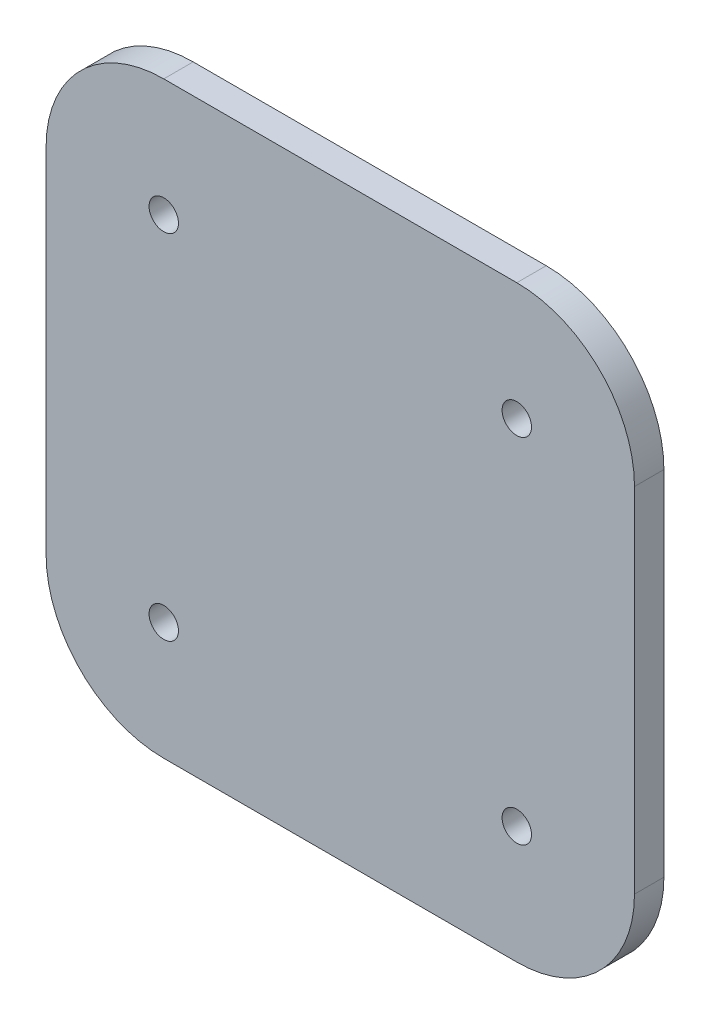
ISO-10303-21;
HEADER;
FILE_DESCRIPTION(('STEP AP214'),'2;1');
FILE_NAME('part.step','',(''),(''),'','','');
FILE_SCHEMA(('AUTOMOTIVE_DESIGN { 1 0 10303 214 1 1 1 1 }'));
ENDSEC;
DATA;
#1=APPLICATION_CONTEXT('core data for automotive mechanical design processes');
#2=APPLICATION_PROTOCOL_DEFINITION('international standard','automotive_design',2000,#1);
#3=PRODUCT_CONTEXT('',#1,'mechanical');
#4=PRODUCT('Part','Part','',(#3));
#5=PRODUCT_RELATED_PRODUCT_CATEGORY('part','',(#4));
#6=PRODUCT_DEFINITION_FORMATION('','',#4);
#7=PRODUCT_DEFINITION_CONTEXT('part definition',#1,'design');
#8=PRODUCT_DEFINITION('design','',#6,#7);
#9=PRODUCT_DEFINITION_SHAPE('','',#8);
#10=(LENGTH_UNIT() NAMED_UNIT(*) SI_UNIT(.MILLI.,.METRE.));
#11=(NAMED_UNIT(*) PLANE_ANGLE_UNIT() SI_UNIT($,.RADIAN.));
#12=(NAMED_UNIT(*) SI_UNIT($,.STERADIAN.) SOLID_ANGLE_UNIT());
#13=UNCERTAINTY_MEASURE_WITH_UNIT(LENGTH_MEASURE(1.E-05),#10,'distance_accuracy_value','');
#14=(GEOMETRIC_REPRESENTATION_CONTEXT(3) GLOBAL_UNCERTAINTY_ASSIGNED_CONTEXT((#13)) GLOBAL_UNIT_ASSIGNED_CONTEXT((#10,
#11,#12)) REPRESENTATION_CONTEXT('',''));
#15=CARTESIAN_POINT('',(0.,0.,0.));
#16=DIRECTION('',(0.,0.,1.));
#17=DIRECTION('',(1.,0.,0.));
#18=AXIS2_PLACEMENT_3D('',#15,#16,#17);
#19=CARTESIAN_POINT('',(-70.3611159052454,39.6364636209814,5.));
#20=DIRECTION('',(1.,0.,0.));
#21=DIRECTION('',(0.,1.,0.));
#22=AXIS2_PLACEMENT_3D('',#19,#20,#21);
#23=PLANE('',#22);
#24=DIRECTION('',(0.,-1.,0.));
#25=VECTOR('',#24,1.);
#26=CARTESIAN_POINT('',(-70.3611159052454,39.6364636209814,0.));
#27=LINE('',#26,#25);
#28=CARTESIAN_POINT('',(-70.3611159052454,19.6364636209814,0.));
#29=VERTEX_POINT('',#28);
#30=CARTESIAN_POINT('',(-70.3611159052453,-40.3635363790186,0.));
#31=VERTEX_POINT('',#30);
#32=EDGE_CURVE('E157',#29,#31,#27,.T.);
#33=ORIENTED_EDGE('',*,*,#32,.T.);
#34=DIRECTION('',(0.,0.,-1.));
#35=VECTOR('',#34,1.);
#36=CARTESIAN_POINT('',(-70.3611159052453,-40.3635363790186,5.));
#37=LINE('',#36,#35);
#38=CARTESIAN_POINT('',(-70.3611159052453,-40.3635363790186,5.));
#39=VERTEX_POINT('',#38);
#40=EDGE_CURVE('E11',#31,#39,#37,.F.);
#41=ORIENTED_EDGE('',*,*,#40,.T.);
#42=DIRECTION('',(0.,-1.,0.));
#43=VECTOR('',#42,1.);
#44=CARTESIAN_POINT('',(-70.3611159052454,39.6364636209814,5.));
#45=LINE('',#44,#43);
#46=CARTESIAN_POINT('',(-70.3611159052454,19.6364636209814,5.));
#47=VERTEX_POINT('',#46);
#48=EDGE_CURVE('E125',#47,#39,#45,.T.);
#49=ORIENTED_EDGE('',*,*,#48,.F.);
#50=DIRECTION('',(0.,0.,-1.));
#51=VECTOR('',#50,1.);
#52=CARTESIAN_POINT('',(-70.3611159052454,19.6364636209814,5.));
#53=LINE('',#52,#51);
#54=EDGE_CURVE('E41',#47,#29,#53,.T.);
#55=ORIENTED_EDGE('',*,*,#54,.T.);
#56=EDGE_LOOP('',(#33,#41,#49,#55));
#57=FACE_BOUND('',#56,.T.);
#58=ADVANCED_FACE('F33',(#57),#23,.F.);
#59=CARTESIAN_POINT('',(-70.3611159052453,-60.3635363790186,5.));
#60=DIRECTION('',(0.,1.,0.));
#61=DIRECTION('',(0.,0.,1.));
#62=AXIS2_PLACEMENT_3D('',#59,#60,#61);
#63=PLANE('',#62);
#64=DIRECTION('',(1.,0.,0.));
#65=VECTOR('',#64,1.);
#66=CARTESIAN_POINT('',(-70.3611159052453,-60.3635363790186,0.));
#67=LINE('',#66,#65);
#68=CARTESIAN_POINT('',(-50.3611159052453,-60.3635363790186,0.));
#69=VERTEX_POINT('',#68);
#70=CARTESIAN_POINT('',(9.63888409475464,-60.3635363790186,0.));
#71=VERTEX_POINT('',#70);
#72=EDGE_CURVE('E130',#69,#71,#67,.T.);
#73=ORIENTED_EDGE('',*,*,#72,.T.);
#74=DIRECTION('',(0.,0.,-1.));
#75=VECTOR('',#74,1.);
#76=CARTESIAN_POINT('',(9.63888409475466,-60.3635363790186,5.));
#77=LINE('',#76,#75);
#78=CARTESIAN_POINT('',(9.63888409475464,-60.3635363790186,5.));
#79=VERTEX_POINT('',#78);
#80=EDGE_CURVE('E48',#71,#79,#77,.F.);
#81=ORIENTED_EDGE('',*,*,#80,.T.);
#82=DIRECTION('',(1.,0.,0.));
#83=VECTOR('',#82,1.);
#84=CARTESIAN_POINT('',(-70.3611159052453,-60.3635363790186,5.));
#85=LINE('',#84,#83);
#86=CARTESIAN_POINT('',(-50.3611159052453,-60.3635363790186,5.));
#87=VERTEX_POINT('',#86);
#88=EDGE_CURVE('E128',#87,#79,#85,.T.);
#89=ORIENTED_EDGE('',*,*,#88,.F.);
#90=DIRECTION('',(0.,0.,-1.));
#91=VECTOR('',#90,1.);
#92=CARTESIAN_POINT('',(-50.3611159052453,-60.3635363790186,5.));
#93=LINE('',#92,#91);
#94=EDGE_CURVE('E149',#87,#69,#93,.T.);
#95=ORIENTED_EDGE('',*,*,#94,.T.);
#96=EDGE_LOOP('',(#73,#81,#89,#95));
#97=FACE_BOUND('',#96,.T.);
#98=ADVANCED_FACE('F219',(#97),#63,.F.);
#99=CARTESIAN_POINT('',(29.6388840947547,39.6364636209814,5.));
#100=DIRECTION('',(-1.,0.,0.));
#101=DIRECTION('',(0.,-1.,0.));
#102=AXIS2_PLACEMENT_3D('',#99,#100,#101);
#103=PLANE('',#102);
#104=DIRECTION('',(0.,1.,0.));
#105=VECTOR('',#104,1.);
#106=CARTESIAN_POINT('',(29.6388840947547,39.6364636209814,0.));
#107=LINE('',#106,#105);
#108=CARTESIAN_POINT('',(29.6388840947547,-40.3635363790186,0.));
#109=VERTEX_POINT('',#108);
#110=CARTESIAN_POINT('',(29.6388840947547,19.6364636209814,0.));
#111=VERTEX_POINT('',#110);
#112=EDGE_CURVE('E126',#109,#111,#107,.T.);
#113=ORIENTED_EDGE('',*,*,#112,.T.);
#114=DIRECTION('',(0.,0.,-1.));
#115=VECTOR('',#114,1.);
#116=CARTESIAN_POINT('',(29.6388840947547,19.6364636209814,5.));
#117=LINE('',#116,#115);
#118=CARTESIAN_POINT('',(29.6388840947547,19.6364636209814,5.));
#119=VERTEX_POINT('',#118);
#120=EDGE_CURVE('E104',#111,#119,#117,.F.);
#121=ORIENTED_EDGE('',*,*,#120,.T.);
#122=DIRECTION('',(0.,1.,0.));
#123=VECTOR('',#122,1.);
#124=CARTESIAN_POINT('',(29.6388840947547,39.6364636209814,5.));
#125=LINE('',#124,#123);
#126=CARTESIAN_POINT('',(29.6388840947547,-40.3635363790186,5.));
#127=VERTEX_POINT('',#126);
#128=EDGE_CURVE('E169',#127,#119,#125,.T.);
#129=ORIENTED_EDGE('',*,*,#128,.F.);
#130=DIRECTION('',(0.,0.,-1.));
#131=VECTOR('',#130,1.);
#132=CARTESIAN_POINT('',(29.6388840947547,-40.3635363790186,5.));
#133=LINE('',#132,#131);
#134=EDGE_CURVE('E109',#127,#109,#133,.T.);
#135=ORIENTED_EDGE('',*,*,#134,.T.);
#136=EDGE_LOOP('',(#113,#121,#129,#135));
#137=FACE_BOUND('',#136,.T.);
#138=ADVANCED_FACE('F216',(#137),#103,.F.);
#139=CARTESIAN_POINT('',(-70.3611159052454,39.6364636209814,5.));
#140=DIRECTION('',(0.,-1.,0.));
#141=DIRECTION('',(0.,0.,-1.));
#142=AXIS2_PLACEMENT_3D('',#139,#140,#141);
#143=PLANE('',#142);
#144=DIRECTION('',(-1.,0.,0.));
#145=VECTOR('',#144,1.);
#146=CARTESIAN_POINT('',(-70.3611159052454,39.6364636209814,5.));
#147=LINE('',#146,#145);
#148=CARTESIAN_POINT('',(9.63888409475465,39.6364636209814,5.));
#149=VERTEX_POINT('',#148);
#150=CARTESIAN_POINT('',(-50.3611159052453,39.6364636209814,5.));
#151=VERTEX_POINT('',#150);
#152=EDGE_CURVE('E119',#149,#151,#147,.T.);
#153=ORIENTED_EDGE('',*,*,#152,.F.);
#154=DIRECTION('',(0.,0.,-1.));
#155=VECTOR('',#154,1.);
#156=CARTESIAN_POINT('',(9.63888409475465,39.6364636209814,5.));
#157=LINE('',#156,#155);
#158=CARTESIAN_POINT('',(9.63888409475465,39.6364636209814,0.));
#159=VERTEX_POINT('',#158);
#160=EDGE_CURVE('E103',#149,#159,#157,.T.);
#161=ORIENTED_EDGE('',*,*,#160,.T.);
#162=DIRECTION('',(-1.,0.,0.));
#163=VECTOR('',#162,1.);
#164=CARTESIAN_POINT('',(-70.3611159052454,39.6364636209814,0.));
#165=LINE('',#164,#163);
#166=CARTESIAN_POINT('',(-50.3611159052453,39.6364636209814,0.));
#167=VERTEX_POINT('',#166);
#168=EDGE_CURVE('E116',#159,#167,#165,.T.);
#169=ORIENTED_EDGE('',*,*,#168,.T.);
#170=DIRECTION('',(0.,0.,-1.));
#171=VECTOR('',#170,1.);
#172=CARTESIAN_POINT('',(-50.3611159052453,39.6364636209814,5.));
#173=LINE('',#172,#171);
#174=EDGE_CURVE('E121',#167,#151,#173,.F.);
#175=ORIENTED_EDGE('',*,*,#174,.T.);
#176=EDGE_LOOP('',(#153,#161,#169,#175));
#177=FACE_BOUND('',#176,.T.);
#178=ADVANCED_FACE('F115',(#177),#143,.F.);
#179=CARTESIAN_POINT('',(-70.3611159052453,-60.3635363790186,5.));
#180=DIRECTION('',(0.,0.,1.));
#181=DIRECTION('',(1.,0.,0.));
#182=AXIS2_PLACEMENT_3D('',#179,#180,#181);
#183=PLANE('',#182);
#184=CARTESIAN_POINT('',(9.63888409475466,19.6364636209814,5.));
#185=DIRECTION('',(0.,0.,1.));
#186=DIRECTION('',(1.,0.,0.));
#187=AXIS2_PLACEMENT_3D('',#184,#185,#186);
#188=CIRCLE('',#187,2.5);
#189=CARTESIAN_POINT('',(12.1388840947547,19.6364636209814,5.));
#190=VERTEX_POINT('',#189);
#191=EDGE_CURVE('E188',#190,#190,#188,.T.);
#192=ORIENTED_EDGE('',*,*,#191,.F.);
#193=EDGE_LOOP('',(#192));
#194=FACE_BOUND('',#193,.T.);
#195=CARTESIAN_POINT('',(9.63888409475466,-40.3635363790186,5.));
#196=DIRECTION('',(0.,0.,1.));
#197=DIRECTION('',(1.,0.,0.));
#198=AXIS2_PLACEMENT_3D('',#195,#196,#197);
#199=CIRCLE('',#198,2.5);
#200=CARTESIAN_POINT('',(12.1388840947547,-40.3635363790186,5.));
#201=VERTEX_POINT('',#200);
#202=EDGE_CURVE('E182',#201,#201,#199,.T.);
#203=ORIENTED_EDGE('',*,*,#202,.F.);
#204=EDGE_LOOP('',(#203));
#205=FACE_BOUND('',#204,.T.);
#206=CARTESIAN_POINT('',(-50.3611159052453,-40.3635363790186,5.));
#207=DIRECTION('',(0.,0.,1.));
#208=DIRECTION('',(1.,0.,0.));
#209=AXIS2_PLACEMENT_3D('',#206,#207,#208);
#210=CIRCLE('',#209,2.5);
#211=CARTESIAN_POINT('',(-47.8611159052454,-40.3635363790186,5.));
#212=VERTEX_POINT('',#211);
#213=EDGE_CURVE('E176',#212,#212,#210,.T.);
#214=ORIENTED_EDGE('',*,*,#213,.F.);
#215=EDGE_LOOP('',(#214));
#216=FACE_BOUND('',#215,.T.);
#217=CARTESIAN_POINT('',(-50.3611159052453,19.6364636209814,5.));
#218=DIRECTION('',(0.,0.,1.));
#219=DIRECTION('',(1.,0.,0.));
#220=AXIS2_PLACEMENT_3D('',#217,#218,#219);
#221=CIRCLE('',#220,2.49999999999999);
#222=CARTESIAN_POINT('',(-47.8611159052454,19.6364636209814,5.));
#223=VERTEX_POINT('',#222);
#224=EDGE_CURVE('E165',#223,#223,#221,.T.);
#225=ORIENTED_EDGE('',*,*,#224,.F.);
#226=EDGE_LOOP('',(#225));
#227=FACE_BOUND('',#226,.T.);
#228=ORIENTED_EDGE('',*,*,#128,.T.);
#229=CARTESIAN_POINT('',(9.63888409475465,19.6364636209814,5.));
#230=DIRECTION('',(0.,0.,1.));
#231=DIRECTION('',(1.,0.,0.));
#232=AXIS2_PLACEMENT_3D('',#229,#230,#231);
#233=CIRCLE('',#232,20.);
#234=EDGE_CURVE('E147',#119,#149,#233,.T.);
#235=ORIENTED_EDGE('',*,*,#234,.T.);
#236=ORIENTED_EDGE('',*,*,#152,.T.);
#237=CARTESIAN_POINT('',(-50.3611159052453,19.6364636209814,5.));
#238=DIRECTION('',(0.,0.,1.));
#239=DIRECTION('',(1.,0.,0.));
#240=AXIS2_PLACEMENT_3D('',#237,#238,#239);
#241=CIRCLE('',#240,20.);
#242=EDGE_CURVE('E142',#151,#47,#241,.T.);
#243=ORIENTED_EDGE('',*,*,#242,.T.);
#244=ORIENTED_EDGE('',*,*,#48,.T.);
#245=CARTESIAN_POINT('',(-50.3611159052453,-40.3635363790186,5.));
#246=DIRECTION('',(0.,0.,1.));
#247=DIRECTION('',(1.,0.,0.));
#248=AXIS2_PLACEMENT_3D('',#245,#246,#247);
#249=CIRCLE('',#248,20.);
#250=EDGE_CURVE('E55',#39,#87,#249,.T.);
#251=ORIENTED_EDGE('',*,*,#250,.T.);
#252=ORIENTED_EDGE('',*,*,#88,.T.);
#253=CARTESIAN_POINT('',(9.63888409475466,-40.3635363790186,5.));
#254=DIRECTION('',(0.,0.,1.));
#255=DIRECTION('',(1.,0.,0.));
#256=AXIS2_PLACEMENT_3D('',#253,#254,#255);
#257=CIRCLE('',#256,20.);
#258=EDGE_CURVE('E145',#79,#127,#257,.T.);
#259=ORIENTED_EDGE('',*,*,#258,.T.);
#260=EDGE_LOOP('',(#228,#235,#236,#243,#244,#251,#252,#259));
#261=FACE_BOUND('',#260,.T.);
#262=ADVANCED_FACE('F203',(#194,#205,#216,#227,#261),#183,.T.);
#263=CARTESIAN_POINT('',(-70.3611159052453,-60.3635363790186,0.));
#264=DIRECTION('',(0.,0.,1.));
#265=DIRECTION('',(1.,0.,0.));
#266=AXIS2_PLACEMENT_3D('',#263,#264,#265);
#267=PLANE('',#266);
#268=CARTESIAN_POINT('',(9.63888409475466,19.6364636209814,0.));
#269=DIRECTION('',(0.,0.,1.));
#270=DIRECTION('',(1.,0.,0.));
#271=AXIS2_PLACEMENT_3D('',#268,#269,#270);
#272=CIRCLE('',#271,2.5);
#273=CARTESIAN_POINT('',(12.1388840947547,19.6364636209814,0.));
#274=VERTEX_POINT('',#273);
#275=EDGE_CURVE('E185',#274,#274,#272,.T.);
#276=ORIENTED_EDGE('',*,*,#275,.T.);
#277=EDGE_LOOP('',(#276));
#278=FACE_BOUND('',#277,.T.);
#279=CARTESIAN_POINT('',(9.63888409475466,-40.3635363790186,0.));
#280=DIRECTION('',(0.,0.,1.));
#281=DIRECTION('',(1.,0.,0.));
#282=AXIS2_PLACEMENT_3D('',#279,#280,#281);
#283=CIRCLE('',#282,2.5);
#284=CARTESIAN_POINT('',(12.1388840947547,-40.3635363790186,0.));
#285=VERTEX_POINT('',#284);
#286=EDGE_CURVE('E179',#285,#285,#283,.T.);
#287=ORIENTED_EDGE('',*,*,#286,.T.);
#288=EDGE_LOOP('',(#287));
#289=FACE_BOUND('',#288,.T.);
#290=CARTESIAN_POINT('',(-50.3611159052453,-40.3635363790186,0.));
#291=DIRECTION('',(0.,0.,1.));
#292=DIRECTION('',(1.,0.,0.));
#293=AXIS2_PLACEMENT_3D('',#290,#291,#292);
#294=CIRCLE('',#293,2.5);
#295=CARTESIAN_POINT('',(-47.8611159052454,-40.3635363790186,0.));
#296=VERTEX_POINT('',#295);
#297=EDGE_CURVE('E174',#296,#296,#294,.T.);
#298=ORIENTED_EDGE('',*,*,#297,.T.);
#299=EDGE_LOOP('',(#298));
#300=FACE_BOUND('',#299,.T.);
#301=CARTESIAN_POINT('',(-50.3611159052453,19.6364636209814,0.));
#302=DIRECTION('',(0.,0.,1.));
#303=DIRECTION('',(1.,0.,0.));
#304=AXIS2_PLACEMENT_3D('',#301,#302,#303);
#305=CIRCLE('',#304,2.49999999999999);
#306=CARTESIAN_POINT('',(-47.8611159052454,19.6364636209814,0.));
#307=VERTEX_POINT('',#306);
#308=EDGE_CURVE('E162',#307,#307,#305,.T.);
#309=ORIENTED_EDGE('',*,*,#308,.T.);
#310=EDGE_LOOP('',(#309));
#311=FACE_BOUND('',#310,.T.);
#312=ORIENTED_EDGE('',*,*,#168,.F.);
#313=CARTESIAN_POINT('',(9.63888409475465,19.6364636209814,0.));
#314=DIRECTION('',(0.,0.,1.));
#315=DIRECTION('',(1.,0.,0.));
#316=AXIS2_PLACEMENT_3D('',#313,#314,#315);
#317=CIRCLE('',#316,20.);
#318=EDGE_CURVE('E99',#159,#111,#317,.F.);
#319=ORIENTED_EDGE('',*,*,#318,.T.);
#320=ORIENTED_EDGE('',*,*,#112,.F.);
#321=CARTESIAN_POINT('',(9.63888409475466,-40.3635363790186,0.));
#322=DIRECTION('',(0.,0.,1.));
#323=DIRECTION('',(1.,0.,0.));
#324=AXIS2_PLACEMENT_3D('',#321,#322,#323);
#325=CIRCLE('',#324,20.);
#326=EDGE_CURVE('E110',#109,#71,#325,.F.);
#327=ORIENTED_EDGE('',*,*,#326,.T.);
#328=ORIENTED_EDGE('',*,*,#72,.F.);
#329=CARTESIAN_POINT('',(-50.3611159052453,-40.3635363790186,0.));
#330=DIRECTION('',(0.,0.,1.));
#331=DIRECTION('',(1.,0.,0.));
#332=AXIS2_PLACEMENT_3D('',#329,#330,#331);
#333=CIRCLE('',#332,20.);
#334=EDGE_CURVE('E136',#69,#31,#333,.F.);
#335=ORIENTED_EDGE('',*,*,#334,.T.);
#336=ORIENTED_EDGE('',*,*,#32,.F.);
#337=CARTESIAN_POINT('',(-50.3611159052453,19.6364636209814,0.));
#338=DIRECTION('',(0.,0.,1.));
#339=DIRECTION('',(1.,0.,0.));
#340=AXIS2_PLACEMENT_3D('',#337,#338,#339);
#341=CIRCLE('',#340,20.);
#342=EDGE_CURVE('E120',#29,#167,#341,.F.);
#343=ORIENTED_EDGE('',*,*,#342,.T.);
#344=EDGE_LOOP('',(#312,#319,#320,#327,#328,#335,#336,#343));
#345=FACE_BOUND('',#344,.T.);
#346=ADVANCED_FACE('F123',(#278,#289,#300,#311,#345),#267,.F.);
#347=CARTESIAN_POINT('',(-50.3611159052453,19.6364636209814,0.));
#348=DIRECTION('',(0.,0.,1.));
#349=DIRECTION('',(1.,0.,0.));
#350=AXIS2_PLACEMENT_3D('',#347,#348,#349);
#351=CYLINDRICAL_SURFACE('',#350,2.49999999999999);
#352=ORIENTED_EDGE('',*,*,#308,.F.);
#353=EDGE_LOOP('',(#352));
#354=FACE_BOUND('',#353,.T.);
#355=ORIENTED_EDGE('',*,*,#224,.T.);
#356=EDGE_LOOP('',(#355));
#357=FACE_BOUND('',#356,.T.);
#358=ADVANCED_FACE('F281',(#354,#357),#351,.F.);
#359=CARTESIAN_POINT('',(-50.3611159052453,-40.3635363790186,0.));
#360=DIRECTION('',(0.,0.,1.));
#361=DIRECTION('',(1.,0.,0.));
#362=AXIS2_PLACEMENT_3D('',#359,#360,#361);
#363=CYLINDRICAL_SURFACE('',#362,2.5);
#364=ORIENTED_EDGE('',*,*,#297,.F.);
#365=EDGE_LOOP('',(#364));
#366=FACE_BOUND('',#365,.T.);
#367=ORIENTED_EDGE('',*,*,#213,.T.);
#368=EDGE_LOOP('',(#367));
#369=FACE_BOUND('',#368,.T.);
#370=ADVANCED_FACE('F272',(#366,#369),#363,.F.);
#371=CARTESIAN_POINT('',(9.63888409475466,-40.3635363790186,0.));
#372=DIRECTION('',(0.,0.,1.));
#373=DIRECTION('',(1.,0.,0.));
#374=AXIS2_PLACEMENT_3D('',#371,#372,#373);
#375=CYLINDRICAL_SURFACE('',#374,2.5);
#376=ORIENTED_EDGE('',*,*,#286,.F.);
#377=EDGE_LOOP('',(#376));
#378=FACE_BOUND('',#377,.T.);
#379=ORIENTED_EDGE('',*,*,#202,.T.);
#380=EDGE_LOOP('',(#379));
#381=FACE_BOUND('',#380,.T.);
#382=ADVANCED_FACE('F199',(#378,#381),#375,.F.);
#383=CARTESIAN_POINT('',(9.63888409475466,19.6364636209814,0.));
#384=DIRECTION('',(0.,0.,1.));
#385=DIRECTION('',(1.,0.,0.));
#386=AXIS2_PLACEMENT_3D('',#383,#384,#385);
#387=CYLINDRICAL_SURFACE('',#386,2.5);
#388=ORIENTED_EDGE('',*,*,#275,.F.);
#389=EDGE_LOOP('',(#388));
#390=FACE_BOUND('',#389,.T.);
#391=ORIENTED_EDGE('',*,*,#191,.T.);
#392=EDGE_LOOP('',(#391));
#393=FACE_BOUND('',#392,.T.);
#394=ADVANCED_FACE('F196',(#390,#393),#387,.F.);
#395=CARTESIAN_POINT('',(9.63888409475465,19.6364636209814,5.));
#396=DIRECTION('',(0.,0.,-1.));
#397=DIRECTION('',(-1.,0.,0.));
#398=AXIS2_PLACEMENT_3D('',#395,#396,#397);
#399=CYLINDRICAL_SURFACE('',#398,20.);
#400=ORIENTED_EDGE('',*,*,#234,.F.);
#401=ORIENTED_EDGE('',*,*,#120,.F.);
#402=ORIENTED_EDGE('',*,*,#318,.F.);
#403=ORIENTED_EDGE('',*,*,#160,.F.);
#404=EDGE_LOOP('',(#400,#401,#402,#403));
#405=FACE_BOUND('',#404,.T.);
#406=ADVANCED_FACE('F102',(#405),#399,.T.);
#407=CARTESIAN_POINT('',(9.63888409475466,-40.3635363790186,5.));
#408=DIRECTION('',(0.,0.,-1.));
#409=DIRECTION('',(-1.,0.,0.));
#410=AXIS2_PLACEMENT_3D('',#407,#408,#409);
#411=CYLINDRICAL_SURFACE('',#410,20.);
#412=ORIENTED_EDGE('',*,*,#258,.F.);
#413=ORIENTED_EDGE('',*,*,#80,.F.);
#414=ORIENTED_EDGE('',*,*,#326,.F.);
#415=ORIENTED_EDGE('',*,*,#134,.F.);
#416=EDGE_LOOP('',(#412,#413,#414,#415));
#417=FACE_BOUND('',#416,.T.);
#418=ADVANCED_FACE('F218',(#417),#411,.T.);
#419=CARTESIAN_POINT('',(-50.3611159052453,-40.3635363790186,5.));
#420=DIRECTION('',(0.,0.,-1.));
#421=DIRECTION('',(-1.,0.,0.));
#422=AXIS2_PLACEMENT_3D('',#419,#420,#421);
#423=CYLINDRICAL_SURFACE('',#422,20.);
#424=ORIENTED_EDGE('',*,*,#250,.F.);
#425=ORIENTED_EDGE('',*,*,#40,.F.);
#426=ORIENTED_EDGE('',*,*,#334,.F.);
#427=ORIENTED_EDGE('',*,*,#94,.F.);
#428=EDGE_LOOP('',(#424,#425,#426,#427));
#429=FACE_BOUND('',#428,.T.);
#430=ADVANCED_FACE('F222',(#429),#423,.T.);
#431=CARTESIAN_POINT('',(-50.3611159052453,19.6364636209814,5.));
#432=DIRECTION('',(0.,0.,-1.));
#433=DIRECTION('',(-1.,0.,0.));
#434=AXIS2_PLACEMENT_3D('',#431,#432,#433);
#435=CYLINDRICAL_SURFACE('',#434,20.);
#436=ORIENTED_EDGE('',*,*,#242,.F.);
#437=ORIENTED_EDGE('',*,*,#174,.F.);
#438=ORIENTED_EDGE('',*,*,#342,.F.);
#439=ORIENTED_EDGE('',*,*,#54,.F.);
#440=EDGE_LOOP('',(#436,#437,#438,#439));
#441=FACE_BOUND('',#440,.T.);
#442=ADVANCED_FACE('F35',(#441),#435,.T.);
#443=CLOSED_SHELL('',(#58,#98,#138,#178,#262,#346,#358,#370,#382,#394,#406,#418,#430,#442));
#444=MANIFOLD_SOLID_BREP('B2',#443);
#445=ADVANCED_BREP_SHAPE_REPRESENTATION('',(#18,#444),#14);
#446=SHAPE_DEFINITION_REPRESENTATION(#9,#445);
ENDSEC;
END-ISO-10303-21;
